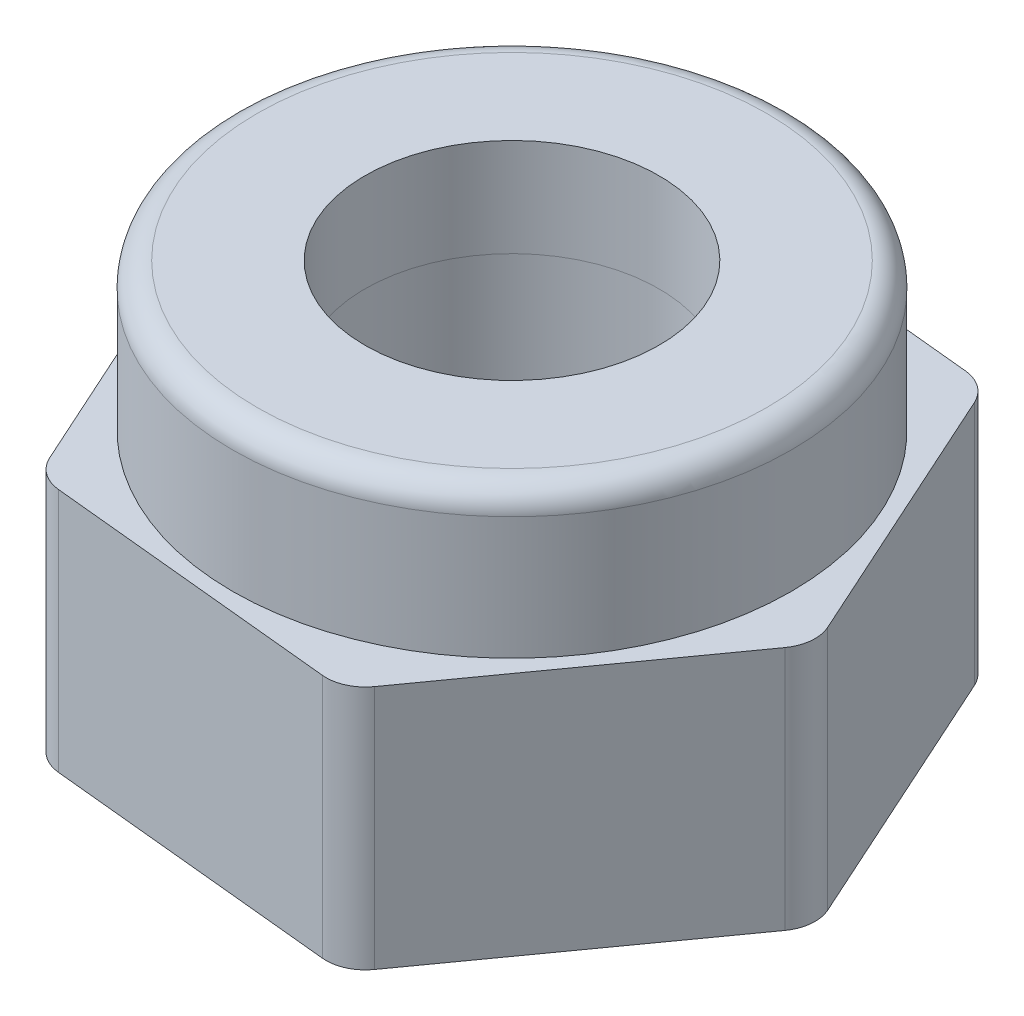
ISO-10303-21;
HEADER;
FILE_DESCRIPTION(('STEP AP214'),'2;1');
FILE_NAME('part.step','',(''),(''),'','','');
FILE_SCHEMA(('AUTOMOTIVE_DESIGN { 1 0 10303 214 1 1 1 1 }'));
ENDSEC;
DATA;
#1=APPLICATION_CONTEXT('core data for automotive mechanical design processes');
#2=APPLICATION_PROTOCOL_DEFINITION('international standard','automotive_design',2000,#1);
#3=PRODUCT_CONTEXT('',#1,'mechanical');
#4=PRODUCT('Part','Part','',(#3));
#5=PRODUCT_RELATED_PRODUCT_CATEGORY('part','',(#4));
#6=PRODUCT_DEFINITION_FORMATION('','',#4);
#7=PRODUCT_DEFINITION_CONTEXT('part definition',#1,'design');
#8=PRODUCT_DEFINITION('design','',#6,#7);
#9=PRODUCT_DEFINITION_SHAPE('','',#8);
#10=(LENGTH_UNIT() NAMED_UNIT(*) SI_UNIT(.MILLI.,.METRE.));
#11=(NAMED_UNIT(*) PLANE_ANGLE_UNIT() SI_UNIT($,.RADIAN.));
#12=(NAMED_UNIT(*) SI_UNIT($,.STERADIAN.) SOLID_ANGLE_UNIT());
#13=UNCERTAINTY_MEASURE_WITH_UNIT(LENGTH_MEASURE(1.E-05),#10,'distance_accuracy_value','');
#14=(GEOMETRIC_REPRESENTATION_CONTEXT(3) GLOBAL_UNCERTAINTY_ASSIGNED_CONTEXT((#13)) GLOBAL_UNIT_ASSIGNED_CONTEXT((#10,
#11,#12)) REPRESENTATION_CONTEXT('',''));
#15=CARTESIAN_POINT('',(0.,0.,0.));
#16=DIRECTION('',(0.,0.,1.));
#17=DIRECTION('',(1.,0.,0.));
#18=AXIS2_PLACEMENT_3D('',#15,#16,#17);
#19=CARTESIAN_POINT('',(0.,4.,0.));
#20=DIRECTION('',(0.,-1.,0.));
#21=DIRECTION('',(0.,0.,-1.));
#22=AXIS2_PLACEMENT_3D('',#19,#20,#21);
#23=CYLINDRICAL_SURFACE('',#22,2.6);
#24=CARTESIAN_POINT('',(0.,4.,0.));
#25=DIRECTION('',(0.,1.,0.));
#26=DIRECTION('',(0.,0.,1.));
#27=AXIS2_PLACEMENT_3D('',#24,#25,#26);
#28=CIRCLE('',#27,2.6);
#29=CARTESIAN_POINT('',(0.,4.,2.6));
#30=VERTEX_POINT('',#29);
#31=EDGE_CURVE('E11',#30,#30,#28,.T.);
#32=ORIENTED_EDGE('',*,*,#31,.F.);
#33=EDGE_LOOP('',(#32));
#34=FACE_BOUND('',#33,.T.);
#35=CARTESIAN_POINT('',(0.,3.,0.));
#36=DIRECTION('',(0.,1.,0.));
#37=DIRECTION('',(0.,0.,1.));
#38=AXIS2_PLACEMENT_3D('',#35,#36,#37);
#39=CIRCLE('',#38,2.6);
#40=CARTESIAN_POINT('',(0.,3.,2.6));
#41=VERTEX_POINT('',#40);
#42=EDGE_CURVE('E49',#41,#41,#39,.T.);
#43=ORIENTED_EDGE('',*,*,#42,.T.);
#44=EDGE_LOOP('',(#43));
#45=FACE_BOUND('',#44,.T.);
#46=ADVANCED_FACE('F42',(#34,#45),#23,.T.);
#47=CARTESIAN_POINT('',(0.,4.,0.));
#48=DIRECTION('',(0.,1.,0.));
#49=DIRECTION('',(0.,0.,1.));
#50=AXIS2_PLACEMENT_3D('',#47,#48,#49);
#51=PLANE('',#50);
#52=CARTESIAN_POINT('',(0.,4.,0.));
#53=DIRECTION('',(0.,1.,0.));
#54=DIRECTION('',(0.,0.,1.));
#55=AXIS2_PLACEMENT_3D('',#52,#53,#54);
#56=CIRCLE('',#55,1.5);
#57=CARTESIAN_POINT('',(0.,4.,1.5));
#58=VERTEX_POINT('',#57);
#59=EDGE_CURVE('E55',#58,#58,#56,.T.);
#60=ORIENTED_EDGE('',*,*,#59,.F.);
#61=EDGE_LOOP('',(#60));
#62=FACE_BOUND('',#61,.T.);
#63=ORIENTED_EDGE('',*,*,#31,.T.);
#64=EDGE_LOOP('',(#63));
#65=FACE_BOUND('',#64,.T.);
#66=ADVANCED_FACE('F71',(#62,#65),#51,.T.);
#67=CARTESIAN_POINT('',(0.,3.,0.));
#68=DIRECTION('',(0.,1.,0.));
#69=DIRECTION('',(0.,0.,1.));
#70=AXIS2_PLACEMENT_3D('',#67,#68,#69);
#71=PLANE('',#70);
#72=CARTESIAN_POINT('',(0.,3.,0.));
#73=DIRECTION('',(0.,1.,0.));
#74=DIRECTION('',(0.,0.,1.));
#75=AXIS2_PLACEMENT_3D('',#72,#73,#74);
#76=CIRCLE('',#75,1.5);
#77=CARTESIAN_POINT('',(0.,3.,1.5));
#78=VERTEX_POINT('',#77);
#79=EDGE_CURVE('E45',#78,#78,#76,.T.);
#80=ORIENTED_EDGE('',*,*,#79,.T.);
#81=EDGE_LOOP('',(#80));
#82=FACE_BOUND('',#81,.T.);
#83=ORIENTED_EDGE('',*,*,#42,.F.);
#84=EDGE_LOOP('',(#83));
#85=FACE_BOUND('',#84,.T.);
#86=ADVANCED_FACE('F62',(#82,#85),#71,.F.);
#87=CARTESIAN_POINT('',(0.,0.,0.));
#88=DIRECTION('',(0.,1.,0.));
#89=DIRECTION('',(0.,0.,1.));
#90=AXIS2_PLACEMENT_3D('',#87,#88,#89);
#91=CYLINDRICAL_SURFACE('',#90,1.5);
#92=ORIENTED_EDGE('',*,*,#59,.T.);
#93=EDGE_LOOP('',(#92));
#94=FACE_BOUND('',#93,.T.);
#95=ORIENTED_EDGE('',*,*,#79,.F.);
#96=EDGE_LOOP('',(#95));
#97=FACE_BOUND('',#96,.T.);
#98=ADVANCED_FACE('F65',(#94,#97),#91,.F.);
#99=CLOSED_SHELL('',(#46,#66,#86,#98));
#100=MANIFOLD_SOLID_BREP('B2',#99);
#101=CARTESIAN_POINT('',(0.,2.5,0.));
#102=DIRECTION('',(0.,1.,0.));
#103=DIRECTION('',(0.,0.,1.));
#104=AXIS2_PLACEMENT_3D('',#101,#102,#103);
#105=PLANE('',#104);
#106=DIRECTION('',(-0.582783224569959,0.,0.812627659607917));
#107=VECTOR('',#106,1.);
#108=CARTESIAN_POINT('',(-1.42847282406976,2.5,-3.15586206778658));
#109=LINE('',#108,#107);
#110=CARTESIAN_POINT('',(-1.56306084470363,2.5,-2.96819374857636));
#111=VERTEX_POINT('',#110);
#112=CARTESIAN_POINT('',(-3.31270511294389,2.5,-0.528505598843404));
#113=VERTEX_POINT('',#112);
#114=EDGE_CURVE('E311',#111,#113,#109,.T.);
#115=ORIENTED_EDGE('',*,*,#114,.T.);
#116=CARTESIAN_POINT('',(-2.98765404910072,2.5,-0.295392309015421));
#117=DIRECTION('',(0.,1.,0.));
#118=DIRECTION('',(0.,0.,1.));
#119=AXIS2_PLACEMENT_3D('',#116,#117,#118);
#120=CIRCLE('',#119,0.4);
#121=CARTESIAN_POINT('',(-3.3520616119731,2.5,-0.130446475114073));
#122=VERTEX_POINT('',#121);
#123=EDGE_CURVE('E254',#113,#122,#120,.T.);
#124=ORIENTED_EDGE('',*,*,#123,.T.);
#125=DIRECTION('',(0.412364584753371,0.,0.911018907180954));
#126=VECTOR('',#125,1.);
#127=CARTESIAN_POINT('',(-3.44729313357775,2.5,-0.340837279633178));
#128=LINE('',#127,#126);
#129=CARTESIAN_POINT('',(-2.11405183111264,2.5,2.6046339836343));
#130=VERTEX_POINT('',#129);
#131=EDGE_CURVE('E217',#122,#130,#128,.T.);
#132=ORIENTED_EDGE('',*,*,#131,.T.);
#133=CARTESIAN_POINT('',(-1.74964426824026,2.5,2.43968814973295));
#134=DIRECTION('',(0.,1.,0.));
#135=DIRECTION('',(0.,0.,1.));
#136=AXIS2_PLACEMENT_3D('',#133,#134,#135);
#137=CIRCLE('',#136,0.4);
#138=CARTESIAN_POINT('',(-1.78900076726947,2.5,2.83774727346228));
#139=VERTEX_POINT('',#138);
#140=EDGE_CURVE('E245',#130,#139,#137,.T.);
#141=ORIENTED_EDGE('',*,*,#140,.T.);
#142=DIRECTION('',(0.995147809323329,0.,0.0983912475730372));
#143=VECTOR('',#142,1.);
#144=CARTESIAN_POINT('',(-2.01882030950799,2.5,2.8150247881534));
#145=LINE('',#144,#143);
#146=CARTESIAN_POINT('',(1.19865328183125,2.5,3.1331395824777));
#147=VERTEX_POINT('',#146);
#148=EDGE_CURVE('E223',#139,#147,#145,.T.);
#149=ORIENTED_EDGE('',*,*,#148,.T.);
#150=CARTESIAN_POINT('',(1.23800978086047,2.5,2.73508045874837));
#151=DIRECTION('',(0.,1.,0.));
#152=DIRECTION('',(0.,0.,1.));
#153=AXIS2_PLACEMENT_3D('',#150,#151,#152);
#154=CIRCLE('',#153,0.4);
#155=CARTESIAN_POINT('',(1.56306084470363,2.5,2.96819374857636));
#156=VERTEX_POINT('',#155);
#157=EDGE_CURVE('E247',#147,#156,#154,.T.);
#158=ORIENTED_EDGE('',*,*,#157,.T.);
#159=DIRECTION('',(0.582783224569959,0.,-0.812627659607917));
#160=VECTOR('',#159,1.);
#161=CARTESIAN_POINT('',(1.42847282406977,2.5,3.15586206778658));
#162=LINE('',#161,#160);
#163=CARTESIAN_POINT('',(3.31270511294389,2.5,0.528505598843407));
#164=VERTEX_POINT('',#163);
#165=EDGE_CURVE('E227',#156,#164,#162,.T.);
#166=ORIENTED_EDGE('',*,*,#165,.T.);
#167=CARTESIAN_POINT('',(2.98765404910072,2.5,0.295392309015423));
#168=DIRECTION('',(0.,1.,0.));
#169=DIRECTION('',(0.,0.,1.));
#170=AXIS2_PLACEMENT_3D('',#167,#168,#169);
#171=CIRCLE('',#170,0.4);
#172=CARTESIAN_POINT('',(3.3520616119731,2.5,0.130446475114075));
#173=VERTEX_POINT('',#172);
#174=EDGE_CURVE('E249',#164,#173,#171,.T.);
#175=ORIENTED_EDGE('',*,*,#174,.T.);
#176=DIRECTION('',(-0.412364584753371,0.,-0.911018907180954));
#177=VECTOR('',#176,1.);
#178=CARTESIAN_POINT('',(3.44729313357775,2.5,0.34083727963318));
#179=LINE('',#178,#177);
#180=CARTESIAN_POINT('',(2.11405183111264,2.5,-2.6046339836343));
#181=VERTEX_POINT('',#180);
#182=EDGE_CURVE('E316',#173,#181,#179,.T.);
#183=ORIENTED_EDGE('',*,*,#182,.T.);
#184=CARTESIAN_POINT('',(1.74964426824026,2.5,-2.43968814973295));
#185=DIRECTION('',(0.,1.,0.));
#186=DIRECTION('',(0.,0.,1.));
#187=AXIS2_PLACEMENT_3D('',#184,#185,#186);
#188=CIRCLE('',#187,0.4);
#189=CARTESIAN_POINT('',(1.78900076726947,2.5,-2.83774727346228));
#190=VERTEX_POINT('',#189);
#191=EDGE_CURVE('E128',#181,#190,#188,.T.);
#192=ORIENTED_EDGE('',*,*,#191,.T.);
#193=DIRECTION('',(-0.995147809323329,0.,-0.098391247573037));
#194=VECTOR('',#193,1.);
#195=CARTESIAN_POINT('',(2.01882030950799,2.5,-2.8150247881534));
#196=LINE('',#195,#194);
#197=CARTESIAN_POINT('',(-1.19865328183125,2.5,-3.1331395824777));
#198=VERTEX_POINT('',#197);
#199=EDGE_CURVE('E312',#190,#198,#196,.T.);
#200=ORIENTED_EDGE('',*,*,#199,.T.);
#201=CARTESIAN_POINT('',(-1.23800978086046,2.5,-2.73508045874837));
#202=DIRECTION('',(0.,1.,0.));
#203=DIRECTION('',(0.,0.,1.));
#204=AXIS2_PLACEMENT_3D('',#201,#202,#203);
#205=CIRCLE('',#204,0.4);
#206=EDGE_CURVE('E252',#198,#111,#205,.T.);
#207=ORIENTED_EDGE('',*,*,#206,.T.);
#208=EDGE_LOOP('',(#115,#124,#132,#141,#149,#158,#166,#175,#183,#192,#200,#207));
#209=FACE_BOUND('',#208,.T.);
#210=CARTESIAN_POINT('',(0.,2.5,0.));
#211=DIRECTION('',(0.,1.,0.));
#212=DIRECTION('',(0.,0.,1.));
#213=AXIS2_PLACEMENT_3D('',#210,#211,#212);
#214=CIRCLE('',#213,2.85);
#215=CARTESIAN_POINT('',(0.,2.5,2.85));
#216=VERTEX_POINT('',#215);
#217=EDGE_CURVE('E300',#216,#216,#214,.T.);
#218=ORIENTED_EDGE('',*,*,#217,.F.);
#219=EDGE_LOOP('',(#218));
#220=FACE_BOUND('',#219,.T.);
#221=ADVANCED_FACE('F105',(#209,#220),#105,.T.);
#222=CARTESIAN_POINT('',(-2.01882030950799,2.5,2.8150247881534));
#223=DIRECTION('',(0.0983912475730372,0.,-0.995147809323329));
#224=DIRECTION('',(-0.995147809323329,0.,-0.0983912475730372));
#225=AXIS2_PLACEMENT_3D('',#222,#223,#224);
#226=PLANE('',#225);
#227=DIRECTION('',(0.995147809323329,0.,0.0983912475730372));
#228=VECTOR('',#227,1.);
#229=CARTESIAN_POINT('',(-2.01882030950799,0.,2.8150247881534));
#230=LINE('',#229,#228);
#231=CARTESIAN_POINT('',(-1.78900076726947,0.,2.83774727346228));
#232=VERTEX_POINT('',#231);
#233=CARTESIAN_POINT('',(1.19865328183125,0.,3.1331395824777));
#234=VERTEX_POINT('',#233);
#235=EDGE_CURVE('E279',#232,#234,#230,.T.);
#236=ORIENTED_EDGE('',*,*,#235,.T.);
#237=DIRECTION('',(0.,-1.,0.));
#238=VECTOR('',#237,1.);
#239=CARTESIAN_POINT('',(1.19865328183125,2.5,3.1331395824777));
#240=LINE('',#239,#238);
#241=EDGE_CURVE('E114',#234,#147,#240,.F.);
#242=ORIENTED_EDGE('',*,*,#241,.T.);
#243=ORIENTED_EDGE('',*,*,#148,.F.);
#244=DIRECTION('',(0.,-1.,0.));
#245=VECTOR('',#244,1.);
#246=CARTESIAN_POINT('',(-1.78900076726947,2.5,2.83774727346228));
#247=LINE('',#246,#245);
#248=EDGE_CURVE('E270',#139,#232,#247,.T.);
#249=ORIENTED_EDGE('',*,*,#248,.T.);
#250=EDGE_LOOP('',(#236,#242,#243,#249));
#251=FACE_BOUND('',#250,.T.);
#252=ADVANCED_FACE('F277',(#251),#226,.F.);
#253=CARTESIAN_POINT('',(1.42847282406977,2.5,3.15586206778658));
#254=DIRECTION('',(-0.812627659607917,0.,-0.582783224569959));
#255=DIRECTION('',(-0.582783224569959,0.,0.812627659607917));
#256=AXIS2_PLACEMENT_3D('',#253,#254,#255);
#257=PLANE('',#256);
#258=DIRECTION('',(0.582783224569959,0.,-0.812627659607917));
#259=VECTOR('',#258,1.);
#260=CARTESIAN_POINT('',(1.42847282406977,0.,3.15586206778658));
#261=LINE('',#260,#259);
#262=CARTESIAN_POINT('',(1.56306084470363,0.,2.96819374857636));
#263=VERTEX_POINT('',#262);
#264=CARTESIAN_POINT('',(3.31270511294389,0.,0.528505598843407));
#265=VERTEX_POINT('',#264);
#266=EDGE_CURVE('E293',#263,#265,#261,.T.);
#267=ORIENTED_EDGE('',*,*,#266,.T.);
#268=DIRECTION('',(0.,-1.,0.));
#269=VECTOR('',#268,1.);
#270=CARTESIAN_POINT('',(3.31270511294389,2.5,0.528505598843407));
#271=LINE('',#270,#269);
#272=EDGE_CURVE('E268',#265,#164,#271,.F.);
#273=ORIENTED_EDGE('',*,*,#272,.T.);
#274=ORIENTED_EDGE('',*,*,#165,.F.);
#275=DIRECTION('',(0.,-1.,0.));
#276=VECTOR('',#275,1.);
#277=CARTESIAN_POINT('',(1.56306084470363,2.5,2.96819374857636));
#278=LINE('',#277,#276);
#279=EDGE_CURVE('E265',#156,#263,#278,.T.);
#280=ORIENTED_EDGE('',*,*,#279,.T.);
#281=EDGE_LOOP('',(#267,#273,#274,#280));
#282=FACE_BOUND('',#281,.T.);
#283=ADVANCED_FACE('F292',(#282),#257,.F.);
#284=CARTESIAN_POINT('',(3.44729313357775,2.5,0.34083727963318));
#285=DIRECTION('',(-0.911018907180954,0.,0.41236458475337));
#286=DIRECTION('',(0.41236458475337,0.,0.911018907180954));
#287=AXIS2_PLACEMENT_3D('',#284,#285,#286);
#288=PLANE('',#287);
#289=DIRECTION('',(-0.412364584753371,0.,-0.911018907180954));
#290=VECTOR('',#289,1.);
#291=CARTESIAN_POINT('',(3.44729313357775,0.,0.34083727963318));
#292=LINE('',#291,#290);
#293=CARTESIAN_POINT('',(3.3520616119731,0.,0.130446475114075));
#294=VERTEX_POINT('',#293);
#295=CARTESIAN_POINT('',(2.11405183111264,0.,-2.6046339836343));
#296=VERTEX_POINT('',#295);
#297=EDGE_CURVE('E296',#294,#296,#292,.T.);
#298=ORIENTED_EDGE('',*,*,#297,.T.);
#299=DIRECTION('',(0.,-1.,0.));
#300=VECTOR('',#299,1.);
#301=CARTESIAN_POINT('',(2.11405183111264,2.5,-2.6046339836343));
#302=LINE('',#301,#300);
#303=EDGE_CURVE('E263',#296,#181,#302,.F.);
#304=ORIENTED_EDGE('',*,*,#303,.T.);
#305=ORIENTED_EDGE('',*,*,#182,.F.);
#306=DIRECTION('',(0.,-1.,0.));
#307=VECTOR('',#306,1.);
#308=CARTESIAN_POINT('',(3.3520616119731,2.5,0.130446475114075));
#309=LINE('',#308,#307);
#310=EDGE_CURVE('E260',#173,#294,#309,.T.);
#311=ORIENTED_EDGE('',*,*,#310,.T.);
#312=EDGE_LOOP('',(#298,#304,#305,#311));
#313=FACE_BOUND('',#312,.T.);
#314=ADVANCED_FACE('F376',(#313),#288,.F.);
#315=CARTESIAN_POINT('',(2.01882030950799,2.5,-2.8150247881534));
#316=DIRECTION('',(-0.098391247573037,0.,0.995147809323329));
#317=DIRECTION('',(0.995147809323329,0.,0.098391247573037));
#318=AXIS2_PLACEMENT_3D('',#315,#316,#317);
#319=PLANE('',#318);
#320=DIRECTION('',(-0.995147809323329,0.,-0.098391247573037));
#321=VECTOR('',#320,1.);
#322=CARTESIAN_POINT('',(2.01882030950799,0.,-2.8150247881534));
#323=LINE('',#322,#321);
#324=CARTESIAN_POINT('',(1.78900076726947,0.,-2.83774727346228));
#325=VERTEX_POINT('',#324);
#326=CARTESIAN_POINT('',(-1.19865328183125,0.,-3.1331395824777));
#327=VERTEX_POINT('',#326);
#328=EDGE_CURVE('E229',#325,#327,#323,.T.);
#329=ORIENTED_EDGE('',*,*,#328,.T.);
#330=DIRECTION('',(0.,-1.,0.));
#331=VECTOR('',#330,1.);
#332=CARTESIAN_POINT('',(-1.19865328183125,2.5,-3.1331395824777));
#333=LINE('',#332,#331);
#334=EDGE_CURVE('E121',#327,#198,#333,.F.);
#335=ORIENTED_EDGE('',*,*,#334,.T.);
#336=ORIENTED_EDGE('',*,*,#199,.F.);
#337=DIRECTION('',(0.,-1.,0.));
#338=VECTOR('',#337,1.);
#339=CARTESIAN_POINT('',(1.78900076726947,2.5,-2.83774727346228));
#340=LINE('',#339,#338);
#341=EDGE_CURVE('E256',#190,#325,#340,.T.);
#342=ORIENTED_EDGE('',*,*,#341,.T.);
#343=EDGE_LOOP('',(#329,#335,#336,#342));
#344=FACE_BOUND('',#343,.T.);
#345=ADVANCED_FACE('F304',(#344),#319,.F.);
#346=CARTESIAN_POINT('',(-1.42847282406976,2.5,-3.15586206778658));
#347=DIRECTION('',(0.812627659607917,0.,0.582783224569959));
#348=DIRECTION('',(0.582783224569959,0.,-0.812627659607917));
#349=AXIS2_PLACEMENT_3D('',#346,#347,#348);
#350=PLANE('',#349);
#351=DIRECTION('',(-0.582783224569959,0.,0.812627659607917));
#352=VECTOR('',#351,1.);
#353=CARTESIAN_POINT('',(-1.42847282406976,0.,-3.15586206778658));
#354=LINE('',#353,#352);
#355=CARTESIAN_POINT('',(-1.56306084470363,0.,-2.96819374857636));
#356=VERTEX_POINT('',#355);
#357=CARTESIAN_POINT('',(-3.31270511294389,0.,-0.528505598843404));
#358=VERTEX_POINT('',#357);
#359=EDGE_CURVE('E224',#356,#358,#354,.T.);
#360=ORIENTED_EDGE('',*,*,#359,.T.);
#361=DIRECTION('',(0.,-1.,0.));
#362=VECTOR('',#361,1.);
#363=CARTESIAN_POINT('',(-3.31270511294388,2.5,-0.528505598843405));
#364=LINE('',#363,#362);
#365=EDGE_CURVE('E202',#358,#113,#364,.F.);
#366=ORIENTED_EDGE('',*,*,#365,.T.);
#367=ORIENTED_EDGE('',*,*,#114,.F.);
#368=DIRECTION('',(0.,-1.,0.));
#369=VECTOR('',#368,1.);
#370=CARTESIAN_POINT('',(-1.56306084470363,2.5,-2.96819374857636));
#371=LINE('',#370,#369);
#372=EDGE_CURVE('E207',#111,#356,#371,.T.);
#373=ORIENTED_EDGE('',*,*,#372,.T.);
#374=EDGE_LOOP('',(#360,#366,#367,#373));
#375=FACE_BOUND('',#374,.T.);
#376=ADVANCED_FACE('F314',(#375),#350,.F.);
#377=CARTESIAN_POINT('',(-3.44729313357775,2.5,-0.340837279633178));
#378=DIRECTION('',(0.911018907180954,0.,-0.412364584753371));
#379=DIRECTION('',(-0.412364584753371,0.,-0.911018907180954));
#380=AXIS2_PLACEMENT_3D('',#377,#378,#379);
#381=PLANE('',#380);
#382=ORIENTED_EDGE('',*,*,#131,.F.);
#383=DIRECTION('',(0.,-1.,0.));
#384=VECTOR('',#383,1.);
#385=CARTESIAN_POINT('',(-3.3520616119731,2.5,-0.130446475114073));
#386=LINE('',#385,#384);
#387=CARTESIAN_POINT('',(-3.3520616119731,0.,-0.130446475114073));
#388=VERTEX_POINT('',#387);
#389=EDGE_CURVE('E201',#122,#388,#386,.T.);
#390=ORIENTED_EDGE('',*,*,#389,.T.);
#391=DIRECTION('',(0.412364584753371,0.,0.911018907180954));
#392=VECTOR('',#391,1.);
#393=CARTESIAN_POINT('',(-3.44729313357775,0.,-0.340837279633178));
#394=LINE('',#393,#392);
#395=CARTESIAN_POINT('',(-2.11405183111264,0.,2.6046339836343));
#396=VERTEX_POINT('',#395);
#397=EDGE_CURVE('E214',#388,#396,#394,.T.);
#398=ORIENTED_EDGE('',*,*,#397,.T.);
#399=DIRECTION('',(0.,-1.,0.));
#400=VECTOR('',#399,1.);
#401=CARTESIAN_POINT('',(-2.11405183111264,2.5,2.6046339836343));
#402=LINE('',#401,#400);
#403=EDGE_CURVE('E219',#396,#130,#402,.F.);
#404=ORIENTED_EDGE('',*,*,#403,.T.);
#405=EDGE_LOOP('',(#382,#390,#398,#404));
#406=FACE_BOUND('',#405,.T.);
#407=ADVANCED_FACE('F213',(#406),#381,.F.);
#408=CARTESIAN_POINT('',(0.,0.,0.));
#409=DIRECTION('',(0.,1.,0.));
#410=DIRECTION('',(0.,0.,1.));
#411=AXIS2_PLACEMENT_3D('',#408,#409,#410);
#412=PLANE('',#411);
#413=CARTESIAN_POINT('',(0.,0.,0.));
#414=DIRECTION('',(0.,1.,0.));
#415=DIRECTION('',(0.,0.,1.));
#416=AXIS2_PLACEMENT_3D('',#413,#414,#415);
#417=CIRCLE('',#416,1.5);
#418=CARTESIAN_POINT('',(0.,0.,1.5));
#419=VERTEX_POINT('',#418);
#420=EDGE_CURVE('E329',#419,#419,#417,.T.);
#421=ORIENTED_EDGE('',*,*,#420,.T.);
#422=EDGE_LOOP('',(#421));
#423=FACE_BOUND('',#422,.T.);
#424=ORIENTED_EDGE('',*,*,#397,.F.);
#425=CARTESIAN_POINT('',(-2.98765404910072,0.,-0.295392309015421));
#426=DIRECTION('',(0.,1.,0.));
#427=DIRECTION('',(0.,0.,1.));
#428=AXIS2_PLACEMENT_3D('',#425,#426,#427);
#429=CIRCLE('',#428,0.4);
#430=EDGE_CURVE('E197',#388,#358,#429,.F.);
#431=ORIENTED_EDGE('',*,*,#430,.T.);
#432=ORIENTED_EDGE('',*,*,#359,.F.);
#433=CARTESIAN_POINT('',(-1.23800978086046,0.,-2.73508045874837));
#434=DIRECTION('',(0.,1.,0.));
#435=DIRECTION('',(0.,0.,1.));
#436=AXIS2_PLACEMENT_3D('',#433,#434,#435);
#437=CIRCLE('',#436,0.4);
#438=EDGE_CURVE('E208',#356,#327,#437,.F.);
#439=ORIENTED_EDGE('',*,*,#438,.T.);
#440=ORIENTED_EDGE('',*,*,#328,.F.);
#441=CARTESIAN_POINT('',(1.74964426824026,0.,-2.43968814973295));
#442=DIRECTION('',(0.,1.,0.));
#443=DIRECTION('',(0.,0.,1.));
#444=AXIS2_PLACEMENT_3D('',#441,#442,#443);
#445=CIRCLE('',#444,0.4);
#446=EDGE_CURVE('E239',#325,#296,#445,.F.);
#447=ORIENTED_EDGE('',*,*,#446,.T.);
#448=ORIENTED_EDGE('',*,*,#297,.F.);
#449=CARTESIAN_POINT('',(2.98765404910072,0.,0.295392309015423));
#450=DIRECTION('',(0.,1.,0.));
#451=DIRECTION('',(0.,0.,1.));
#452=AXIS2_PLACEMENT_3D('',#449,#450,#451);
#453=CIRCLE('',#452,0.4);
#454=EDGE_CURVE('E237',#294,#265,#453,.F.);
#455=ORIENTED_EDGE('',*,*,#454,.T.);
#456=ORIENTED_EDGE('',*,*,#266,.F.);
#457=CARTESIAN_POINT('',(1.23800978086047,0.,2.73508045874837));
#458=DIRECTION('',(0.,1.,0.));
#459=DIRECTION('',(0.,0.,1.));
#460=AXIS2_PLACEMENT_3D('',#457,#458,#459);
#461=CIRCLE('',#460,0.4);
#462=EDGE_CURVE('E235',#263,#234,#461,.F.);
#463=ORIENTED_EDGE('',*,*,#462,.T.);
#464=ORIENTED_EDGE('',*,*,#235,.F.);
#465=CARTESIAN_POINT('',(-1.74964426824026,0.,2.43968814973295));
#466=DIRECTION('',(0.,1.,0.));
#467=DIRECTION('',(0.,0.,1.));
#468=AXIS2_PLACEMENT_3D('',#465,#466,#467);
#469=CIRCLE('',#468,0.4);
#470=EDGE_CURVE('E218',#232,#396,#469,.F.);
#471=ORIENTED_EDGE('',*,*,#470,.T.);
#472=EDGE_LOOP('',(#424,#431,#432,#439,#440,#447,#448,#455,#456,#463,#464,#471));
#473=FACE_BOUND('',#472,.T.);
#474=ADVANCED_FACE('F221',(#423,#473),#412,.F.);
#475=CARTESIAN_POINT('',(-2.98765404910072,2.5,-0.295392309015421));
#476=DIRECTION('',(0.,-1.,0.));
#477=DIRECTION('',(0.,0.,-1.));
#478=AXIS2_PLACEMENT_3D('',#475,#476,#477);
#479=CYLINDRICAL_SURFACE('',#478,0.4);
#480=ORIENTED_EDGE('',*,*,#123,.F.);
#481=ORIENTED_EDGE('',*,*,#365,.F.);
#482=ORIENTED_EDGE('',*,*,#430,.F.);
#483=ORIENTED_EDGE('',*,*,#389,.F.);
#484=EDGE_LOOP('',(#480,#481,#482,#483));
#485=FACE_BOUND('',#484,.T.);
#486=ADVANCED_FACE('F200',(#485),#479,.T.);
#487=CARTESIAN_POINT('',(-1.23800978086046,2.5,-2.73508045874837));
#488=DIRECTION('',(0.,-1.,0.));
#489=DIRECTION('',(0.,0.,-1.));
#490=AXIS2_PLACEMENT_3D('',#487,#488,#489);
#491=CYLINDRICAL_SURFACE('',#490,0.4);
#492=ORIENTED_EDGE('',*,*,#206,.F.);
#493=ORIENTED_EDGE('',*,*,#334,.F.);
#494=ORIENTED_EDGE('',*,*,#438,.F.);
#495=ORIENTED_EDGE('',*,*,#372,.F.);
#496=EDGE_LOOP('',(#492,#493,#494,#495));
#497=FACE_BOUND('',#496,.T.);
#498=ADVANCED_FACE('F308',(#497),#491,.T.);
#499=CARTESIAN_POINT('',(1.74964426824026,2.5,-2.43968814973295));
#500=DIRECTION('',(0.,-1.,0.));
#501=DIRECTION('',(0.,0.,-1.));
#502=AXIS2_PLACEMENT_3D('',#499,#500,#501);
#503=CYLINDRICAL_SURFACE('',#502,0.4);
#504=ORIENTED_EDGE('',*,*,#191,.F.);
#505=ORIENTED_EDGE('',*,*,#303,.F.);
#506=ORIENTED_EDGE('',*,*,#446,.F.);
#507=ORIENTED_EDGE('',*,*,#341,.F.);
#508=EDGE_LOOP('',(#504,#505,#506,#507));
#509=FACE_BOUND('',#508,.T.);
#510=ADVANCED_FACE('F386',(#509),#503,.T.);
#511=CARTESIAN_POINT('',(2.98765404910072,2.5,0.295392309015423));
#512=DIRECTION('',(0.,-1.,0.));
#513=DIRECTION('',(0.,0.,-1.));
#514=AXIS2_PLACEMENT_3D('',#511,#512,#513);
#515=CYLINDRICAL_SURFACE('',#514,0.4);
#516=ORIENTED_EDGE('',*,*,#174,.F.);
#517=ORIENTED_EDGE('',*,*,#272,.F.);
#518=ORIENTED_EDGE('',*,*,#454,.F.);
#519=ORIENTED_EDGE('',*,*,#310,.F.);
#520=EDGE_LOOP('',(#516,#517,#518,#519));
#521=FACE_BOUND('',#520,.T.);
#522=ADVANCED_FACE('F389',(#521),#515,.T.);
#523=CARTESIAN_POINT('',(1.23800978086047,2.5,2.73508045874837));
#524=DIRECTION('',(0.,-1.,0.));
#525=DIRECTION('',(0.,0.,-1.));
#526=AXIS2_PLACEMENT_3D('',#523,#524,#525);
#527=CYLINDRICAL_SURFACE('',#526,0.4);
#528=ORIENTED_EDGE('',*,*,#157,.F.);
#529=ORIENTED_EDGE('',*,*,#241,.F.);
#530=ORIENTED_EDGE('',*,*,#462,.F.);
#531=ORIENTED_EDGE('',*,*,#279,.F.);
#532=EDGE_LOOP('',(#528,#529,#530,#531));
#533=FACE_BOUND('',#532,.T.);
#534=ADVANCED_FACE('F288',(#533),#527,.T.);
#535=CARTESIAN_POINT('',(-1.74964426824026,2.5,2.43968814973295));
#536=DIRECTION('',(0.,-1.,0.));
#537=DIRECTION('',(0.,0.,-1.));
#538=AXIS2_PLACEMENT_3D('',#535,#536,#537);
#539=CYLINDRICAL_SURFACE('',#538,0.4);
#540=ORIENTED_EDGE('',*,*,#140,.F.);
#541=ORIENTED_EDGE('',*,*,#403,.F.);
#542=ORIENTED_EDGE('',*,*,#470,.F.);
#543=ORIENTED_EDGE('',*,*,#248,.F.);
#544=EDGE_LOOP('',(#540,#541,#542,#543));
#545=FACE_BOUND('',#544,.T.);
#546=ADVANCED_FACE('F357',(#545),#539,.T.);
#547=CARTESIAN_POINT('',(0.,4.,0.));
#548=DIRECTION('',(0.,-1.,0.));
#549=DIRECTION('',(0.,0.,-1.));
#550=AXIS2_PLACEMENT_3D('',#547,#548,#549);
#551=CYLINDRICAL_SURFACE('',#550,2.85);
#552=CARTESIAN_POINT('',(0.,3.75,0.));
#553=DIRECTION('',(0.,1.,0.));
#554=DIRECTION('',(0.,0.,1.));
#555=AXIS2_PLACEMENT_3D('',#552,#553,#554);
#556=CIRCLE('',#555,2.85);
#557=CARTESIAN_POINT('',(0.,3.75,2.85));
#558=VERTEX_POINT('',#557);
#559=EDGE_CURVE('E40',#558,#558,#556,.F.);
#560=ORIENTED_EDGE('',*,*,#559,.T.);
#561=EDGE_LOOP('',(#560));
#562=FACE_BOUND('',#561,.T.);
#563=ORIENTED_EDGE('',*,*,#217,.T.);
#564=EDGE_LOOP('',(#563));
#565=FACE_BOUND('',#564,.T.);
#566=ADVANCED_FACE('F352',(#562,#565),#551,.T.);
#567=CARTESIAN_POINT('',(0.,3.75,0.));
#568=DIRECTION('',(0.,1.,0.));
#569=DIRECTION('',(0.,0.,1.));
#570=AXIS2_PLACEMENT_3D('',#567,#568,#569);
#571=TOROIDAL_SURFACE('',#570,2.6,0.25);
#572=ORIENTED_EDGE('',*,*,#559,.F.);
#573=EDGE_LOOP('',(#572));
#574=FACE_BOUND('',#573,.T.);
#575=CARTESIAN_POINT('',(0.,4.,0.));
#576=DIRECTION('',(0.,1.,0.));
#577=DIRECTION('',(0.,0.,1.));
#578=AXIS2_PLACEMENT_3D('',#575,#576,#577);
#579=CIRCLE('',#578,2.6);
#580=CARTESIAN_POINT('',(0.,4.,2.6));
#581=VERTEX_POINT('',#580);
#582=EDGE_CURVE('E324',#581,#581,#579,.T.);
#583=ORIENTED_EDGE('',*,*,#582,.F.);
#584=EDGE_LOOP('',(#583));
#585=FACE_BOUND('',#584,.T.);
#586=ADVANCED_FACE('F107',(#574,#585),#571,.T.);
#587=CARTESIAN_POINT('',(0.,3.,0.));
#588=DIRECTION('',(0.,1.,0.));
#589=DIRECTION('',(0.,0.,1.));
#590=AXIS2_PLACEMENT_3D('',#587,#588,#589);
#591=CYLINDRICAL_SURFACE('',#590,2.6);
#592=CARTESIAN_POINT('',(0.,3.,0.));
#593=DIRECTION('',(0.,1.,0.));
#594=DIRECTION('',(0.,0.,1.));
#595=AXIS2_PLACEMENT_3D('',#592,#593,#594);
#596=CIRCLE('',#595,2.6);
#597=CARTESIAN_POINT('',(0.,3.,2.6));
#598=VERTEX_POINT('',#597);
#599=EDGE_CURVE('E323',#598,#598,#596,.T.);
#600=ORIENTED_EDGE('',*,*,#599,.F.);
#601=EDGE_LOOP('',(#600));
#602=FACE_BOUND('',#601,.T.);
#603=ORIENTED_EDGE('',*,*,#582,.T.);
#604=EDGE_LOOP('',(#603));
#605=FACE_BOUND('',#604,.T.);
#606=ADVANCED_FACE('F342',(#602,#605),#591,.F.);
#607=CARTESIAN_POINT('',(0.,3.,0.));
#608=DIRECTION('',(0.,1.,0.));
#609=DIRECTION('',(0.,0.,1.));
#610=AXIS2_PLACEMENT_3D('',#607,#608,#609);
#611=PLANE('',#610);
#612=CARTESIAN_POINT('',(0.,3.,0.));
#613=DIRECTION('',(0.,1.,0.));
#614=DIRECTION('',(0.,0.,1.));
#615=AXIS2_PLACEMENT_3D('',#612,#613,#614);
#616=CIRCLE('',#615,1.5);
#617=CARTESIAN_POINT('',(0.,3.,1.5));
#618=VERTEX_POINT('',#617);
#619=EDGE_CURVE('E109',#618,#618,#616,.T.);
#620=ORIENTED_EDGE('',*,*,#619,.F.);
#621=EDGE_LOOP('',(#620));
#622=FACE_BOUND('',#621,.T.);
#623=ORIENTED_EDGE('',*,*,#599,.T.);
#624=EDGE_LOOP('',(#623));
#625=FACE_BOUND('',#624,.T.);
#626=ADVANCED_FACE('F339',(#622,#625),#611,.T.);
#627=CARTESIAN_POINT('',(0.,0.,0.));
#628=DIRECTION('',(0.,1.,0.));
#629=DIRECTION('',(0.,0.,1.));
#630=AXIS2_PLACEMENT_3D('',#627,#628,#629);
#631=CYLINDRICAL_SURFACE('',#630,1.5);
#632=ORIENTED_EDGE('',*,*,#619,.T.);
#633=EDGE_LOOP('',(#632));
#634=FACE_BOUND('',#633,.T.);
#635=ORIENTED_EDGE('',*,*,#420,.F.);
#636=EDGE_LOOP('',(#635));
#637=FACE_BOUND('',#636,.T.);
#638=ADVANCED_FACE('F336',(#634,#637),#631,.F.);
#639=CLOSED_SHELL('',(#221,#252,#283,#314,#345,#376,#407,#474,#486,#498,#510,#522,#534,#546,
#566,#586,#606,#626,#638));
#640=MANIFOLD_SOLID_BREP('B6',#639);
#641=ADVANCED_BREP_SHAPE_REPRESENTATION('',(#18,#100,#640),#14);
#642=SHAPE_DEFINITION_REPRESENTATION(#9,#641);
ENDSEC;
END-ISO-10303-21;
